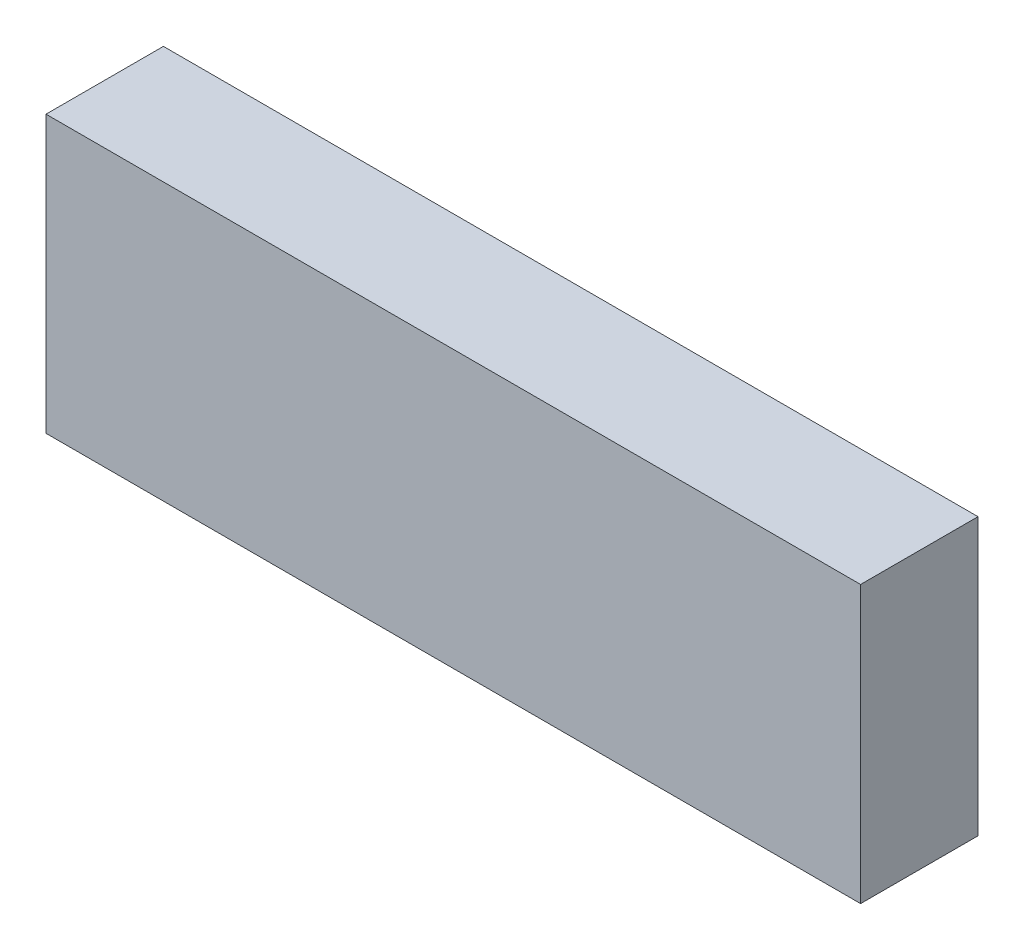
ISO-10303-21;
HEADER;
FILE_DESCRIPTION(('STEP AP214'),'2;1');
FILE_NAME('part.step','',(''),(''),'','','');
FILE_SCHEMA(('AUTOMOTIVE_DESIGN { 1 0 10303 214 1 1 1 1 }'));
ENDSEC;
DATA;
#1=APPLICATION_CONTEXT('core data for automotive mechanical design processes');
#2=APPLICATION_PROTOCOL_DEFINITION('international standard','automotive_design',2000,#1);
#3=PRODUCT_CONTEXT('',#1,'mechanical');
#4=PRODUCT('Part','Part','',(#3));
#5=PRODUCT_RELATED_PRODUCT_CATEGORY('part','',(#4));
#6=PRODUCT_DEFINITION_FORMATION('','',#4);
#7=PRODUCT_DEFINITION_CONTEXT('part definition',#1,'design');
#8=PRODUCT_DEFINITION('design','',#6,#7);
#9=PRODUCT_DEFINITION_SHAPE('','',#8);
#10=(LENGTH_UNIT() NAMED_UNIT(*) SI_UNIT(.MILLI.,.METRE.));
#11=(NAMED_UNIT(*) PLANE_ANGLE_UNIT() SI_UNIT($,.RADIAN.));
#12=(NAMED_UNIT(*) SI_UNIT($,.STERADIAN.) SOLID_ANGLE_UNIT());
#13=UNCERTAINTY_MEASURE_WITH_UNIT(LENGTH_MEASURE(1.E-05),#10,'distance_accuracy_value','');
#14=(GEOMETRIC_REPRESENTATION_CONTEXT(3) GLOBAL_UNCERTAINTY_ASSIGNED_CONTEXT((#13)) GLOBAL_UNIT_ASSIGNED_CONTEXT((#10,
#11,#12)) REPRESENTATION_CONTEXT('',''));
#15=CARTESIAN_POINT('',(0.,0.,0.));
#16=DIRECTION('',(0.,0.,1.));
#17=DIRECTION('',(1.,0.,0.));
#18=AXIS2_PLACEMENT_3D('',#15,#16,#17);
#19=CARTESIAN_POINT('',(-8.325,2.825,2.4));
#20=DIRECTION('',(1.,0.,0.));
#21=DIRECTION('',(0.,0.,-1.));
#22=AXIS2_PLACEMENT_3D('',#19,#20,#21);
#23=PLANE('',#22);
#24=DIRECTION('',(0.,-1.,0.));
#25=VECTOR('',#24,1.);
#26=CARTESIAN_POINT('',(-8.325,2.825,0.));
#27=LINE('',#26,#25);
#28=CARTESIAN_POINT('',(-8.325,2.825,0.));
#29=VERTEX_POINT('',#28);
#30=CARTESIAN_POINT('',(-8.325,-2.825,0.));
#31=VERTEX_POINT('',#30);
#32=EDGE_CURVE('E97',#29,#31,#27,.T.);
#33=ORIENTED_EDGE('',*,*,#32,.T.);
#34=DIRECTION('',(0.,0.,-1.));
#35=VECTOR('',#34,1.);
#36=CARTESIAN_POINT('',(-8.325,-2.825,2.4));
#37=LINE('',#36,#35);
#38=CARTESIAN_POINT('',(-8.325,-2.825,2.4));
#39=VERTEX_POINT('',#38);
#40=EDGE_CURVE('E11',#39,#31,#37,.T.);
#41=ORIENTED_EDGE('',*,*,#40,.F.);
#42=DIRECTION('',(0.,-1.,0.));
#43=VECTOR('',#42,1.);
#44=CARTESIAN_POINT('',(-8.325,2.825,2.4));
#45=LINE('',#44,#43);
#46=CARTESIAN_POINT('',(-8.325,2.825,2.4));
#47=VERTEX_POINT('',#46);
#48=EDGE_CURVE('E85',#47,#39,#45,.T.);
#49=ORIENTED_EDGE('',*,*,#48,.F.);
#50=DIRECTION('',(0.,0.,-1.));
#51=VECTOR('',#50,1.);
#52=CARTESIAN_POINT('',(-8.325,2.825,2.4));
#53=LINE('',#52,#51);
#54=EDGE_CURVE('E93',#47,#29,#53,.T.);
#55=ORIENTED_EDGE('',*,*,#54,.T.);
#56=EDGE_LOOP('',(#33,#41,#49,#55));
#57=FACE_BOUND('',#56,.T.);
#58=ADVANCED_FACE('F34',(#57),#23,.F.);
#59=CARTESIAN_POINT('',(-8.325,-2.825,2.4));
#60=DIRECTION('',(0.,1.,0.));
#61=DIRECTION('',(0.,0.,1.));
#62=AXIS2_PLACEMENT_3D('',#59,#60,#61);
#63=PLANE('',#62);
#64=DIRECTION('',(1.,0.,0.));
#65=VECTOR('',#64,1.);
#66=CARTESIAN_POINT('',(-8.325,-2.825,0.));
#67=LINE('',#66,#65);
#68=CARTESIAN_POINT('',(8.325,-2.825,0.));
#69=VERTEX_POINT('',#68);
#70=EDGE_CURVE('E89',#31,#69,#67,.T.);
#71=ORIENTED_EDGE('',*,*,#70,.T.);
#72=DIRECTION('',(0.,0.,-1.));
#73=VECTOR('',#72,1.);
#74=CARTESIAN_POINT('',(8.325,-2.825,2.4));
#75=LINE('',#74,#73);
#76=CARTESIAN_POINT('',(8.325,-2.825,2.4));
#77=VERTEX_POINT('',#76);
#78=EDGE_CURVE('E42',#77,#69,#75,.T.);
#79=ORIENTED_EDGE('',*,*,#78,.F.);
#80=DIRECTION('',(1.,0.,0.));
#81=VECTOR('',#80,1.);
#82=CARTESIAN_POINT('',(-8.325,-2.825,2.4));
#83=LINE('',#82,#81);
#84=EDGE_CURVE('E80',#39,#77,#83,.T.);
#85=ORIENTED_EDGE('',*,*,#84,.F.);
#86=ORIENTED_EDGE('',*,*,#40,.T.);
#87=EDGE_LOOP('',(#71,#79,#85,#86));
#88=FACE_BOUND('',#87,.T.);
#89=ADVANCED_FACE('F88',(#88),#63,.F.);
#90=CARTESIAN_POINT('',(8.325,-2.825,2.4));
#91=DIRECTION('',(-1.,0.,0.));
#92=DIRECTION('',(0.,0.,1.));
#93=AXIS2_PLACEMENT_3D('',#90,#91,#92);
#94=PLANE('',#93);
#95=DIRECTION('',(0.,1.,0.));
#96=VECTOR('',#95,1.);
#97=CARTESIAN_POINT('',(8.325,-2.825,0.));
#98=LINE('',#97,#96);
#99=CARTESIAN_POINT('',(8.325,2.825,0.));
#100=VERTEX_POINT('',#99);
#101=EDGE_CURVE('E67',#69,#100,#98,.T.);
#102=ORIENTED_EDGE('',*,*,#101,.T.);
#103=DIRECTION('',(0.,0.,-1.));
#104=VECTOR('',#103,1.);
#105=CARTESIAN_POINT('',(8.325,2.825,2.4));
#106=LINE('',#105,#104);
#107=CARTESIAN_POINT('',(8.325,2.825,2.4));
#108=VERTEX_POINT('',#107);
#109=EDGE_CURVE('E90',#108,#100,#106,.T.);
#110=ORIENTED_EDGE('',*,*,#109,.F.);
#111=DIRECTION('',(0.,1.,0.));
#112=VECTOR('',#111,1.);
#113=CARTESIAN_POINT('',(8.325,-2.825,2.4));
#114=LINE('',#113,#112);
#115=EDGE_CURVE('E83',#77,#108,#114,.T.);
#116=ORIENTED_EDGE('',*,*,#115,.F.);
#117=ORIENTED_EDGE('',*,*,#78,.T.);
#118=EDGE_LOOP('',(#102,#110,#116,#117));
#119=FACE_BOUND('',#118,.T.);
#120=ADVANCED_FACE('F91',(#119),#94,.F.);
#121=CARTESIAN_POINT('',(8.325,2.825,2.4));
#122=DIRECTION('',(0.,-1.,0.));
#123=DIRECTION('',(0.,0.,-1.));
#124=AXIS2_PLACEMENT_3D('',#121,#122,#123);
#125=PLANE('',#124);
#126=DIRECTION('',(-1.,0.,0.));
#127=VECTOR('',#126,1.);
#128=CARTESIAN_POINT('',(8.325,2.825,0.));
#129=LINE('',#128,#127);
#130=EDGE_CURVE('E73',#100,#29,#129,.T.);
#131=ORIENTED_EDGE('',*,*,#130,.T.);
#132=ORIENTED_EDGE('',*,*,#54,.F.);
#133=DIRECTION('',(-1.,0.,0.));
#134=VECTOR('',#133,1.);
#135=CARTESIAN_POINT('',(8.325,2.825,2.4));
#136=LINE('',#135,#134);
#137=EDGE_CURVE('E50',#108,#47,#136,.T.);
#138=ORIENTED_EDGE('',*,*,#137,.F.);
#139=ORIENTED_EDGE('',*,*,#109,.T.);
#140=EDGE_LOOP('',(#131,#132,#138,#139));
#141=FACE_BOUND('',#140,.T.);
#142=ADVANCED_FACE('F104',(#141),#125,.F.);
#143=CARTESIAN_POINT('',(0.,0.,2.4));
#144=DIRECTION('',(0.,0.,1.));
#145=DIRECTION('',(1.,0.,0.));
#146=AXIS2_PLACEMENT_3D('',#143,#144,#145);
#147=PLANE('',#146);
#148=ORIENTED_EDGE('',*,*,#48,.T.);
#149=ORIENTED_EDGE('',*,*,#84,.T.);
#150=ORIENTED_EDGE('',*,*,#115,.T.);
#151=ORIENTED_EDGE('',*,*,#137,.T.);
#152=EDGE_LOOP('',(#148,#149,#150,#151));
#153=FACE_BOUND('',#152,.T.);
#154=ADVANCED_FACE('F81',(#153),#147,.T.);
#155=CARTESIAN_POINT('',(0.,0.,0.));
#156=DIRECTION('',(0.,0.,1.));
#157=DIRECTION('',(1.,0.,0.));
#158=AXIS2_PLACEMENT_3D('',#155,#156,#157);
#159=PLANE('',#158);
#160=ORIENTED_EDGE('',*,*,#32,.F.);
#161=ORIENTED_EDGE('',*,*,#130,.F.);
#162=ORIENTED_EDGE('',*,*,#101,.F.);
#163=ORIENTED_EDGE('',*,*,#70,.F.);
#164=EDGE_LOOP('',(#160,#161,#162,#163));
#165=FACE_BOUND('',#164,.T.);
#166=ADVANCED_FACE('F107',(#165),#159,.F.);
#167=CLOSED_SHELL('',(#58,#89,#120,#142,#154,#166));
#168=MANIFOLD_SOLID_BREP('B2',#167);
#169=ADVANCED_BREP_SHAPE_REPRESENTATION('',(#18,#168),#14);
#170=SHAPE_DEFINITION_REPRESENTATION(#9,#169);
ENDSEC;
END-ISO-10303-21;
